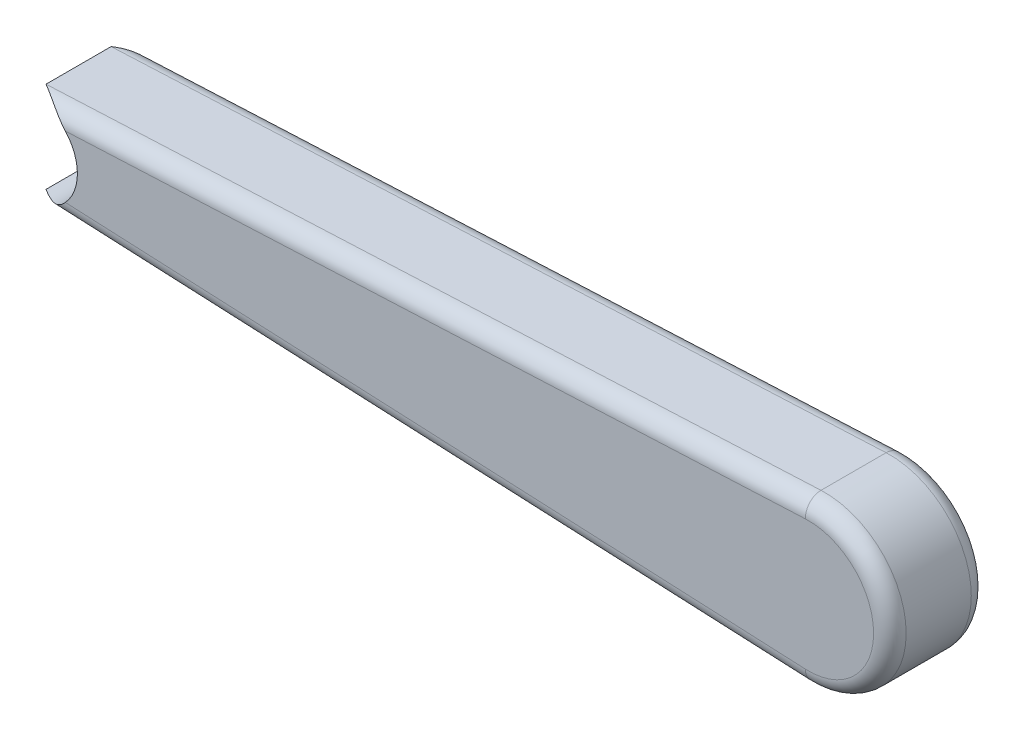
ISO-10303-21;
HEADER;
FILE_DESCRIPTION(('STEP AP214'),'2;1');
FILE_NAME('part.step','',(''),(''),'','','');
FILE_SCHEMA(('AUTOMOTIVE_DESIGN { 1 0 10303 214 1 1 1 1 }'));
ENDSEC;
DATA;
#1=APPLICATION_CONTEXT('core data for automotive mechanical design processes');
#2=APPLICATION_PROTOCOL_DEFINITION('international standard','automotive_design',2000,#1);
#3=PRODUCT_CONTEXT('',#1,'mechanical');
#4=PRODUCT('Part','Part','',(#3));
#5=PRODUCT_RELATED_PRODUCT_CATEGORY('part','',(#4));
#6=PRODUCT_DEFINITION_FORMATION('','',#4);
#7=PRODUCT_DEFINITION_CONTEXT('part definition',#1,'design');
#8=PRODUCT_DEFINITION('design','',#6,#7);
#9=PRODUCT_DEFINITION_SHAPE('','',#8);
#10=(LENGTH_UNIT() NAMED_UNIT(*) SI_UNIT(.MILLI.,.METRE.));
#11=(NAMED_UNIT(*) PLANE_ANGLE_UNIT() SI_UNIT($,.RADIAN.));
#12=(NAMED_UNIT(*) SI_UNIT($,.STERADIAN.) SOLID_ANGLE_UNIT());
#13=UNCERTAINTY_MEASURE_WITH_UNIT(LENGTH_MEASURE(1.E-05),#10,'distance_accuracy_value','');
#14=(GEOMETRIC_REPRESENTATION_CONTEXT(3) GLOBAL_UNCERTAINTY_ASSIGNED_CONTEXT((#13)) GLOBAL_UNIT_ASSIGNED_CONTEXT((#10,
#11,#12)) REPRESENTATION_CONTEXT('',''));
#15=CARTESIAN_POINT('',(0.,0.,0.));
#16=DIRECTION('',(0.,0.,1.));
#17=DIRECTION('',(1.,0.,0.));
#18=AXIS2_PLACEMENT_3D('',#15,#16,#17);
#19=CARTESIAN_POINT('',(-0.449126792822246,-9.72752272707756,15.));
#20=DIRECTION('',(-0.0461215932914046,-0.998935833090525,0.));
#21=DIRECTION('',(0.998935833090526,-0.0461215932914046,0.));
#22=AXIS2_PLACEMENT_3D('',#19,#20,#21);
#23=PLANE('',#22);
#24=DIRECTION('',(0.,0.,-1.));
#25=VECTOR('',#24,1.);
#26=CARTESIAN_POINT('',(59.3111452820953,-12.4866979136316,15.));
#27=LINE('',#26,#25);
#28=CARTESIAN_POINT('',(59.3111452820953,-12.4866979136316,12.5));
#29=VERTEX_POINT('',#28);
#30=CARTESIAN_POINT('',(59.3111452820953,-12.4866979136316,2.5));
#31=VERTEX_POINT('',#30);
#32=EDGE_CURVE('E109',#29,#31,#27,.T.);
#33=ORIENTED_EDGE('',*,*,#32,.F.);
#34=DIRECTION('',(-0.998935833090526,0.0461215932914046,0.));
#35=VECTOR('',#34,1.);
#36=CARTESIAN_POINT('',(-0.449126792822246,-9.72752272707756,12.5));
#37=LINE('',#36,#35);
#38=CARTESIAN_POINT('',(-59.6851859548019,-6.99255083163368,12.5));
#39=VERTEX_POINT('',#38);
#40=EDGE_CURVE('E123',#29,#39,#37,.T.);
#41=ORIENTED_EDGE('',*,*,#40,.T.);
#42=DIRECTION('',(0.,0.,-1.));
#43=VECTOR('',#42,1.);
#44=CARTESIAN_POINT('',(-59.6851859548019,-6.99255083163368,15.));
#45=LINE('',#44,#43);
#46=CARTESIAN_POINT('',(-59.6851859548019,-6.99255083163368,2.5));
#47=VERTEX_POINT('',#46);
#48=EDGE_CURVE('E230',#39,#47,#45,.T.);
#49=ORIENTED_EDGE('',*,*,#48,.T.);
#50=DIRECTION('',(-0.998935833090526,0.0461215932914046,0.));
#51=VECTOR('',#50,1.);
#52=CARTESIAN_POINT('',(59.3111452820954,-12.4866979136316,2.5));
#53=LINE('',#52,#51);
#54=EDGE_CURVE('E126',#47,#31,#53,.F.);
#55=ORIENTED_EDGE('',*,*,#54,.T.);
#56=EDGE_LOOP('',(#33,#41,#49,#55));
#57=FACE_BOUND('',#56,.T.);
#58=ADVANCED_FACE('F37',(#57),#23,.T.);
#59=CARTESIAN_POINT('',(59.8876651982379,0.,15.));
#60=DIRECTION('',(0.,0.,-1.));
#61=DIRECTION('',(-1.,0.,0.));
#62=AXIS2_PLACEMENT_3D('',#59,#60,#61);
#63=CYLINDRICAL_SURFACE('',#62,12.5);
#64=DIRECTION('',(0.,0.,-1.));
#65=VECTOR('',#64,1.);
#66=CARTESIAN_POINT('',(59.3111452820953,12.4866979136316,15.));
#67=LINE('',#66,#65);
#68=CARTESIAN_POINT('',(59.3111452820953,12.4866979136316,12.5));
#69=VERTEX_POINT('',#68);
#70=CARTESIAN_POINT('',(59.3111452820953,12.4866979136316,2.5));
#71=VERTEX_POINT('',#70);
#72=EDGE_CURVE('E112',#69,#71,#67,.T.);
#73=ORIENTED_EDGE('',*,*,#72,.F.);
#74=CARTESIAN_POINT('',(59.8876651982379,0.,12.5));
#75=DIRECTION('',(0.,0.,1.));
#76=DIRECTION('',(1.,0.,0.));
#77=AXIS2_PLACEMENT_3D('',#74,#75,#76);
#78=CIRCLE('',#77,12.5);
#79=EDGE_CURVE('E106',#69,#29,#78,.F.);
#80=ORIENTED_EDGE('',*,*,#79,.T.);
#81=ORIENTED_EDGE('',*,*,#32,.T.);
#82=CARTESIAN_POINT('',(59.8876651982379,0.,2.5));
#83=DIRECTION('',(0.,0.,1.));
#84=DIRECTION('',(1.,0.,0.));
#85=AXIS2_PLACEMENT_3D('',#82,#83,#84);
#86=CIRCLE('',#85,12.5);
#87=EDGE_CURVE('E117',#31,#71,#86,.T.);
#88=ORIENTED_EDGE('',*,*,#87,.T.);
#89=EDGE_LOOP('',(#73,#80,#81,#88));
#90=FACE_BOUND('',#89,.T.);
#91=ADVANCED_FACE('F108',(#90),#63,.T.);
#92=CARTESIAN_POINT('',(-0.449126792822246,9.72752272707756,15.));
#93=DIRECTION('',(-0.0461215932914046,0.998935833090525,0.));
#94=DIRECTION('',(-0.998935833090526,-0.0461215932914046,0.));
#95=AXIS2_PLACEMENT_3D('',#92,#93,#94);
#96=PLANE('',#95);
#97=DIRECTION('',(0.,0.,-1.));
#98=VECTOR('',#97,1.);
#99=CARTESIAN_POINT('',(-59.6851859548019,6.99255083163368,15.));
#100=LINE('',#99,#98);
#101=CARTESIAN_POINT('',(-59.6851859548019,6.99255083163368,12.5));
#102=VERTEX_POINT('',#101);
#103=CARTESIAN_POINT('',(-59.6851859548019,6.99255083163368,2.5));
#104=VERTEX_POINT('',#103);
#105=EDGE_CURVE('E224',#102,#104,#100,.T.);
#106=ORIENTED_EDGE('',*,*,#105,.F.);
#107=DIRECTION('',(0.998935833090526,0.0461215932914046,0.));
#108=VECTOR('',#107,1.);
#109=CARTESIAN_POINT('',(-0.449126792822246,9.72752272707756,12.5));
#110=LINE('',#109,#108);
#111=EDGE_CURVE('E11',#102,#69,#110,.T.);
#112=ORIENTED_EDGE('',*,*,#111,.T.);
#113=ORIENTED_EDGE('',*,*,#72,.T.);
#114=DIRECTION('',(0.998935833090526,0.0461215932914046,0.));
#115=VECTOR('',#114,1.);
#116=CARTESIAN_POINT('',(-59.685185954802,6.99255083163368,2.5));
#117=LINE('',#116,#115);
#118=EDGE_CURVE('E47',#71,#104,#117,.F.);
#119=ORIENTED_EDGE('',*,*,#118,.T.);
#120=EDGE_LOOP('',(#106,#112,#113,#119));
#121=FACE_BOUND('',#120,.T.);
#122=ADVANCED_FACE('F162',(#121),#96,.T.);
#123=CARTESIAN_POINT('',(-59.3623348017621,0.,15.));
#124=DIRECTION('',(0.,0.,-1.));
#125=DIRECTION('',(-1.,0.,0.));
#126=AXIS2_PLACEMENT_3D('',#123,#124,#125);
#127=CYLINDRICAL_SURFACE('',#126,7.);
#128=ORIENTED_EDGE('',*,*,#48,.F.);
#129=CARTESIAN_POINT('',(-54.2136852835608,-4.74251074207802,15.));
#130=CARTESIAN_POINT('',(-54.2857688809073,-4.82078786130837,14.999989903161));
#131=CARTESIAN_POINT('',(-54.3596120330912,-4.89735387343226,14.9960147027452));
#132=CARTESIAN_POINT('',(-54.5102333802524,-5.046611148359,14.9810015135034));
#133=CARTESIAN_POINT('',(-54.5870072357984,-5.1193077853945,14.9699736130719));
#134=CARTESIAN_POINT('',(-54.7424854727158,-5.26002993660031,14.9418313537456));
#135=CARTESIAN_POINT('',(-54.8211693137245,-5.32808836945269,14.9247667539175));
#136=CARTESIAN_POINT('',(-54.9807037027159,-5.46003941384874,14.88527111107));
#137=CARTESIAN_POINT('',(-55.0615553598209,-5.52392983322105,14.8628372725938));
#138=CARTESIAN_POINT('',(-55.2711874887031,-5.68226924250099,14.7992974874816));
#139=CARTESIAN_POINT('',(-55.4012833091692,-5.77363198037448,14.7547962663925));
#140=CARTESIAN_POINT('',(-55.6648463666458,-5.94587168628554,14.6565059740294));
#141=CARTESIAN_POINT('',(-55.7983147824306,-6.02674492577692,14.6027136159286));
#142=CARTESIAN_POINT('',(-56.0685814474761,-6.1786204972817,14.4872903982221));
#143=CARTESIAN_POINT('',(-56.2053944111578,-6.24956351387237,14.4256163234066));
#144=CARTESIAN_POINT('',(-56.4809558106255,-6.38129944335314,14.2961550084738));
#145=CARTESIAN_POINT('',(-56.6197042350546,-6.44209241577465,14.2283678042144));
#146=CARTESIAN_POINT('',(-56.9572689709623,-6.57732413571593,14.0583732052278));
#147=CARTESIAN_POINT('',(-57.1568380480167,-6.64676988067116,13.9536672026404));
#148=CARTESIAN_POINT('',(-57.5578572659798,-6.76666018853576,13.737138992786));
#149=CARTESIAN_POINT('',(-57.7593082618211,-6.81709563741483,13.6253134021573));
#150=CARTESIAN_POINT('',(-58.1627186261433,-6.89950722420976,13.3970650515206));
#151=CARTESIAN_POINT('',(-58.3646757455864,-6.9315257306403,13.2806535067423));
#152=CARTESIAN_POINT('',(-58.7687798554707,-6.97775311486921,13.0449079360379));
#153=CARTESIAN_POINT('',(-58.9709267234901,-6.99196981204316,12.9255752167271));
#154=CARTESIAN_POINT('',(-59.3390615821514,-7.00193348894461,12.7068771117413));
#155=CARTESIAN_POINT('',(-59.5051013470123,-7.00050999960199,12.6077257013232));
#156=CARTESIAN_POINT('',(-59.6756201465849,-6.99298757279725,12.5057226181347));
#157=CARTESIAN_POINT('',(-59.6804031797625,-6.99277165401399,12.5028612995492));
#158=CARTESIAN_POINT('',(-59.6851859548019,-6.99255083163368,12.5));
#159=B_SPLINE_CURVE_WITH_KNOTS('',3,(#129,#130,#131,#132,#133,#134,#135,#136,#137,#138,#139,
#140,#141,#142,#143,#144,#145,#146,#147,#148,#149,#150,#151,#152,#153,#154,#155,#156,#157,#158),
.UNSPECIFIED.,.F.,.F.,(4,2,2,2,2,2,2,2,2,2,2,2,2,2,4),(0.,0.319035638769247,0.637615936985806,
0.95362920020144,1.26980735281077,1.76429474066089,2.25895741769144,2.75645908447378,
3.25395783323755,3.96041067998187,4.66720178909223,5.37236034123229,6.07720904644113,
6.65699589126657,6.6737290982866),.UNSPECIFIED.);
#160=CARTESIAN_POINT('',(-54.2136852835608,-4.74251074207802,15.));
#161=VERTEX_POINT('',#160);
#162=EDGE_CURVE('E138',#39,#161,#159,.F.);
#163=ORIENTED_EDGE('',*,*,#162,.T.);
#164=CARTESIAN_POINT('',(-59.3623348017621,0.,15.));
#165=DIRECTION('',(0.,0.,1.));
#166=DIRECTION('',(1.,0.,0.));
#167=AXIS2_PLACEMENT_3D('',#164,#165,#166);
#168=CIRCLE('',#167,7.);
#169=CARTESIAN_POINT('',(-54.2136852835608,4.74251074207802,15.));
#170=VERTEX_POINT('',#169);
#171=EDGE_CURVE('E227',#161,#170,#168,.T.);
#172=ORIENTED_EDGE('',*,*,#171,.T.);
#173=CARTESIAN_POINT('',(-54.2136852835608,4.74251074207802,15.));
#174=CARTESIAN_POINT('',(-54.2857688809073,4.82078786130837,14.999989903161));
#175=CARTESIAN_POINT('',(-54.3596120330912,4.89735387343226,14.9960147027452));
#176=CARTESIAN_POINT('',(-54.5102333802524,5.046611148359,14.9810015135034));
#177=CARTESIAN_POINT('',(-54.5870072357984,5.1193077853945,14.9699736130719));
#178=CARTESIAN_POINT('',(-54.7424854727157,5.26002993660031,14.9418313537456));
#179=CARTESIAN_POINT('',(-54.8211693137245,5.32808836945269,14.9247667539175));
#180=CARTESIAN_POINT('',(-54.9807037027159,5.46003941384874,14.88527111107));
#181=CARTESIAN_POINT('',(-55.0615553598209,5.52392983322105,14.8628372725938));
#182=CARTESIAN_POINT('',(-55.2711874887032,5.682269242501,14.7992974874816));
#183=CARTESIAN_POINT('',(-55.4012833091692,5.77363198037449,14.7547962663925));
#184=CARTESIAN_POINT('',(-55.6648463666458,5.94587168628555,14.6565059740294));
#185=CARTESIAN_POINT('',(-55.7983147824306,6.02674492577693,14.6027136159286));
#186=CARTESIAN_POINT('',(-56.0685814474762,6.17862049728172,14.4872903982221));
#187=CARTESIAN_POINT('',(-56.2053944111578,6.24956351387238,14.4256163234066));
#188=CARTESIAN_POINT('',(-56.4809558106255,6.38129944335315,14.2961550084738));
#189=CARTESIAN_POINT('',(-56.6197042350546,6.44209241577466,14.2283678042144));
#190=CARTESIAN_POINT('',(-56.9572689709623,6.57732413571593,14.0583732052278));
#191=CARTESIAN_POINT('',(-57.1568380480168,6.64676988067116,13.9536672026405));
#192=CARTESIAN_POINT('',(-57.5578572659797,6.76666018853576,13.737138992786));
#193=CARTESIAN_POINT('',(-57.759308261821,6.81709563741484,13.6253134021572));
#194=CARTESIAN_POINT('',(-58.1627186261433,6.89950722420976,13.3970650515206));
#195=CARTESIAN_POINT('',(-58.3646757455865,6.93152573064029,13.2806535067424));
#196=CARTESIAN_POINT('',(-58.7687798554707,6.97775311486922,13.0449079360378));
#197=CARTESIAN_POINT('',(-58.9709267234899,6.99196981204318,12.9255752167267));
#198=CARTESIAN_POINT('',(-59.3390615821516,7.0019334889446,12.7068771117417));
#199=CARTESIAN_POINT('',(-59.5051013470129,7.00050999960194,12.6077257013243));
#200=CARTESIAN_POINT('',(-59.675620146585,6.99298757279725,12.5057226181347));
#201=CARTESIAN_POINT('',(-59.6804031797625,6.99277165401399,12.5028612995493));
#202=CARTESIAN_POINT('',(-59.6851859548019,6.99255083163369,12.5));
#203=B_SPLINE_CURVE_WITH_KNOTS('',3,(#173,#174,#175,#176,#177,#178,#179,#180,#181,#182,#183,
#184,#185,#186,#187,#188,#189,#190,#191,#192,#193,#194,#195,#196,#197,#198,#199,#200,#201,#202),
.UNSPECIFIED.,.F.,.F.,(4,2,2,2,2,2,2,2,2,2,2,2,2,2,4),(0.,0.319035638769244,0.637615936985786,
0.953629200201438,1.26980735281077,1.7642947406609,2.25895741769147,2.75645908447379,
3.25395783323755,3.96041067998187,4.66720178909221,5.37236034123227,6.07720904644113,
6.65699589126657,6.6737290982866),.UNSPECIFIED.);
#204=EDGE_CURVE('E141',#170,#102,#203,.T.);
#205=ORIENTED_EDGE('',*,*,#204,.T.);
#206=ORIENTED_EDGE('',*,*,#105,.T.);
#207=CARTESIAN_POINT('',(-54.2136852835608,4.74251074207801,0.));
#208=CARTESIAN_POINT('',(-54.2857688809073,4.82078786130838,1.00968389873677E-05));
#209=CARTESIAN_POINT('',(-54.3596120330912,4.89735387343227,0.00398529725479135));
#210=CARTESIAN_POINT('',(-54.5102333802524,5.04661114835903,0.0189984864965754));
#211=CARTESIAN_POINT('',(-54.5870072357984,5.11930778539454,0.0300263869280563));
#212=CARTESIAN_POINT('',(-54.7424854727158,5.26002993660035,0.0581686462543731));
#213=CARTESIAN_POINT('',(-54.8211693137245,5.32808836945272,0.0752332460824593));
#214=CARTESIAN_POINT('',(-54.9807037027159,5.46003941384875,0.114728888930019));
#215=CARTESIAN_POINT('',(-55.0615553598209,5.52392983322105,0.137162727406194));
#216=CARTESIAN_POINT('',(-55.2711874887031,5.68226924250099,0.200702512518371));
#217=CARTESIAN_POINT('',(-55.4012833091692,5.77363198037447,0.24520373360753));
#218=CARTESIAN_POINT('',(-55.6648463666458,5.94587168628552,0.343494025970577));
#219=CARTESIAN_POINT('',(-55.7983147824305,6.0267449257769,0.397286384071358));
#220=CARTESIAN_POINT('',(-56.0685814474761,6.17862049728169,0.512709601777909));
#221=CARTESIAN_POINT('',(-56.2053944111578,6.24956351387236,0.57438367659342));
#222=CARTESIAN_POINT('',(-56.4809558106255,6.38129944335314,0.703844991526236));
#223=CARTESIAN_POINT('',(-56.6197042350546,6.44209241577465,0.7716321957856));
#224=CARTESIAN_POINT('',(-56.9572689709623,6.57732413571593,0.941626794772241));
#225=CARTESIAN_POINT('',(-57.1568380480167,6.64676988067116,1.04633279735957));
#226=CARTESIAN_POINT('',(-57.5578572659798,6.76666018853577,1.26286100721403));
#227=CARTESIAN_POINT('',(-57.7593082618211,6.81709563741484,1.37468659784271));
#228=CARTESIAN_POINT('',(-58.1627186261433,6.89950722420977,1.6029349484795));
#229=CARTESIAN_POINT('',(-58.3646757455863,6.9315257306403,1.71934649325794));
#230=CARTESIAN_POINT('',(-58.7687798554709,6.9777531148692,1.95509206396187));
#231=CARTESIAN_POINT('',(-58.9709267234906,6.99196981204314,2.07442478327217));
#232=CARTESIAN_POINT('',(-59.339061582151,7.00193348894463,2.29312288825929));
#233=CARTESIAN_POINT('',(-59.5051013470109,7.00050999960205,2.39227429867898));
#234=CARTESIAN_POINT('',(-59.6756201465849,6.99298757279725,2.49427738186546));
#235=CARTESIAN_POINT('',(-59.6804031797625,6.99277165401399,2.49713870045082));
#236=CARTESIAN_POINT('',(-59.6851859548019,6.99255083163368,2.5));
#237=B_SPLINE_CURVE_WITH_KNOTS('',3,(#207,#208,#209,#210,#211,#212,#213,#214,#215,#216,#217,
#218,#219,#220,#221,#222,#223,#224,#225,#226,#227,#228,#229,#230,#231,#232,#233,#234,#235,#236),
.UNSPECIFIED.,.F.,.F.,(4,2,2,2,2,2,2,2,2,2,2,2,2,2,4),(0.,0.319035638769276,0.637615936985863,
0.953629200201476,1.26980735281077,1.76429474066086,2.25895741769139,2.75645908447376,
3.25395783323755,3.96041067998189,4.66720178909227,5.37236034123231,6.07720904644113,
6.65699589126657,6.6737290982866),.UNSPECIFIED.);
#238=CARTESIAN_POINT('',(-54.2136852835608,4.74251074207802,0.));
#239=VERTEX_POINT('',#238);
#240=EDGE_CURVE('E139',#104,#239,#237,.F.);
#241=ORIENTED_EDGE('',*,*,#240,.T.);
#242=CARTESIAN_POINT('',(-59.3623348017621,0.,0.));
#243=DIRECTION('',(0.,0.,1.));
#244=DIRECTION('',(1.,0.,0.));
#245=AXIS2_PLACEMENT_3D('',#242,#243,#244);
#246=CIRCLE('',#245,7.);
#247=CARTESIAN_POINT('',(-54.2136852835608,-4.74251074207802,0.));
#248=VERTEX_POINT('',#247);
#249=EDGE_CURVE('E235',#248,#239,#246,.T.);
#250=ORIENTED_EDGE('',*,*,#249,.F.);
#251=CARTESIAN_POINT('',(-54.2136852835608,-4.74251074207801,0.));
#252=CARTESIAN_POINT('',(-54.2857688809073,-4.82078786130839,1.0096838987301E-05));
#253=CARTESIAN_POINT('',(-54.3596120330912,-4.89735387343229,0.00398529725479232));
#254=CARTESIAN_POINT('',(-54.5102333802524,-5.04661114835906,0.01899848649658));
#255=CARTESIAN_POINT('',(-54.5870072357985,-5.11930778539458,0.0300263869280634));
#256=CARTESIAN_POINT('',(-54.7424854727158,-5.26002993660039,0.0581686462543831));
#257=CARTESIAN_POINT('',(-54.8211693137246,-5.32808836945275,0.0752332460824681));
#258=CARTESIAN_POINT('',(-54.9807037027159,-5.46003941384877,0.114728888930024));
#259=CARTESIAN_POINT('',(-55.0615553598209,-5.52392983322106,0.137162727406197));
#260=CARTESIAN_POINT('',(-55.2711874887031,-5.68226924250098,0.200702512518369));
#261=CARTESIAN_POINT('',(-55.4012833091692,-5.77363198037446,0.245203733607524));
#262=CARTESIAN_POINT('',(-55.6648463666457,-5.9458716862855,0.343494025970564));
#263=CARTESIAN_POINT('',(-55.7983147824305,-6.02674492577687,0.39728638407134));
#264=CARTESIAN_POINT('',(-56.0685814474761,-6.17862049728166,0.51270960177789));
#265=CARTESIAN_POINT('',(-56.2053944111578,-6.24956351387234,0.574383676593405));
#266=CARTESIAN_POINT('',(-56.4809558106255,-6.38129944335313,0.703844991526227));
#267=CARTESIAN_POINT('',(-56.6197042350546,-6.44209241577465,0.771632195785594));
#268=CARTESIAN_POINT('',(-56.9572689709623,-6.57732413571593,0.941626794772249));
#269=CARTESIAN_POINT('',(-57.1568380480167,-6.64676988067116,1.0463327973596));
#270=CARTESIAN_POINT('',(-57.5578572659798,-6.76666018853578,1.26286100721402));
#271=CARTESIAN_POINT('',(-57.7593082618212,-6.81709563741485,1.37468659784265));
#272=CARTESIAN_POINT('',(-58.1627186261433,-6.89950722420978,1.60293494847961));
#273=CARTESIAN_POINT('',(-58.3646757455862,-6.93152573064032,1.71934649325826));
#274=CARTESIAN_POINT('',(-58.7687798554711,-6.9777531148692,1.95509206396159));
#275=CARTESIAN_POINT('',(-58.9709267234913,-6.99196981204311,2.07442478327107));
#276=CARTESIAN_POINT('',(-59.3390615821504,-7.00193348894465,2.2931228882602));
#277=CARTESIAN_POINT('',(-59.5051013470091,-7.00050999960213,2.39227429868209));
#278=CARTESIAN_POINT('',(-59.6756201465848,-6.99298757279726,2.49427738186564));
#279=CARTESIAN_POINT('',(-59.6804031797624,-6.99277165401399,2.49713870045091));
#280=CARTESIAN_POINT('',(-59.6851859548019,-6.99255083163368,2.5));
#281=B_SPLINE_CURVE_WITH_KNOTS('',3,(#251,#252,#253,#254,#255,#256,#257,#258,#259,#260,#261,
#262,#263,#264,#265,#266,#267,#268,#269,#270,#271,#272,#273,#274,#275,#276,#277,#278,#279,#280),
.UNSPECIFIED.,.F.,.F.,(4,2,2,2,2,2,2,2,2,2,2,2,2,2,4),(0.,0.319035638769314,0.637615936985938,
0.953629200201512,1.26980735281077,1.76429474066082,2.25895741769132,2.75645908447373,
3.25395783323755,3.9604106799819,4.66720178909233,5.37236034123235,6.07720904644112,
6.65699589126657,6.6737290982866),.UNSPECIFIED.);
#282=EDGE_CURVE('E171',#248,#47,#281,.T.);
#283=ORIENTED_EDGE('',*,*,#282,.T.);
#284=EDGE_LOOP('',(#128,#163,#172,#205,#206,#241,#250,#283));
#285=FACE_BOUND('',#284,.T.);
#286=ADVANCED_FACE('F156',(#285),#127,.F.);
#287=CARTESIAN_POINT('',(0.,0.,15.));
#288=DIRECTION('',(0.,0.,1.));
#289=DIRECTION('',(1.,0.,0.));
#290=AXIS2_PLACEMENT_3D('',#287,#288,#289);
#291=PLANE('',#290);
#292=ORIENTED_EDGE('',*,*,#171,.F.);
#293=DIRECTION('',(-0.998935833090526,0.0461215932914046,0.));
#294=VECTOR('',#293,1.);
#295=CARTESIAN_POINT('',(-0.333822809593734,-7.23018314435125,15.));
#296=LINE('',#295,#294);
#297=CARTESIAN_POINT('',(59.4264492653238,-9.98935833090526,15.));
#298=VERTEX_POINT('',#297);
#299=EDGE_CURVE('E257',#161,#298,#296,.F.);
#300=ORIENTED_EDGE('',*,*,#299,.T.);
#301=CARTESIAN_POINT('',(59.8876651982379,0.,15.));
#302=DIRECTION('',(0.,0.,1.));
#303=DIRECTION('',(1.,0.,0.));
#304=AXIS2_PLACEMENT_3D('',#301,#302,#303);
#305=CIRCLE('',#304,10.);
#306=CARTESIAN_POINT('',(59.4264492653238,9.98935833090526,15.));
#307=VERTEX_POINT('',#306);
#308=EDGE_CURVE('E132',#298,#307,#305,.T.);
#309=ORIENTED_EDGE('',*,*,#308,.T.);
#310=DIRECTION('',(0.998935833090526,0.0461215932914046,0.));
#311=VECTOR('',#310,1.);
#312=CARTESIAN_POINT('',(-0.333822809593735,7.23018314435125,15.));
#313=LINE('',#312,#311);
#314=EDGE_CURVE('E220',#307,#170,#313,.F.);
#315=ORIENTED_EDGE('',*,*,#314,.T.);
#316=EDGE_LOOP('',(#292,#300,#309,#315));
#317=FACE_BOUND('',#316,.T.);
#318=ADVANCED_FACE('F161',(#317),#291,.T.);
#319=CARTESIAN_POINT('',(0.,0.,0.));
#320=DIRECTION('',(0.,0.,1.));
#321=DIRECTION('',(1.,0.,0.));
#322=AXIS2_PLACEMENT_3D('',#319,#320,#321);
#323=PLANE('',#322);
#324=CARTESIAN_POINT('',(59.8876651982379,0.,0.));
#325=DIRECTION('',(0.,0.,-1.));
#326=DIRECTION('',(-1.,0.,0.));
#327=AXIS2_PLACEMENT_3D('',#324,#325,#326);
#328=CIRCLE('',#327,5.);
#329=CARTESIAN_POINT('',(54.8876651982379,0.,0.));
#330=VERTEX_POINT('',#329);
#331=EDGE_CURVE('E239',#330,#330,#328,.T.);
#332=ORIENTED_EDGE('',*,*,#331,.F.);
#333=EDGE_LOOP('',(#332));
#334=FACE_BOUND('',#333,.T.);
#335=CARTESIAN_POINT('',(59.8876651982379,0.,0.));
#336=DIRECTION('',(0.,0.,1.));
#337=DIRECTION('',(1.,0.,0.));
#338=AXIS2_PLACEMENT_3D('',#335,#336,#337);
#339=CIRCLE('',#338,10.);
#340=CARTESIAN_POINT('',(59.4264492653238,9.98935833090525,0.));
#341=VERTEX_POINT('',#340);
#342=CARTESIAN_POINT('',(59.4264492653238,-9.98935833090526,0.));
#343=VERTEX_POINT('',#342);
#344=EDGE_CURVE('E55',#341,#343,#339,.F.);
#345=ORIENTED_EDGE('',*,*,#344,.T.);
#346=DIRECTION('',(-0.998935833090526,0.0461215932914046,0.));
#347=VECTOR('',#346,1.);
#348=CARTESIAN_POINT('',(-59.5698819715735,-4.49521124890736,0.));
#349=LINE('',#348,#347);
#350=EDGE_CURVE('E264',#343,#248,#349,.T.);
#351=ORIENTED_EDGE('',*,*,#350,.T.);
#352=ORIENTED_EDGE('',*,*,#249,.T.);
#353=DIRECTION('',(0.998935833090526,0.0461215932914046,0.));
#354=VECTOR('',#353,1.);
#355=CARTESIAN_POINT('',(59.4264492653239,9.98935833090525,0.));
#356=LINE('',#355,#354);
#357=EDGE_CURVE('E60',#239,#341,#356,.T.);
#358=ORIENTED_EDGE('',*,*,#357,.T.);
#359=EDGE_LOOP('',(#345,#351,#352,#358));
#360=FACE_BOUND('',#359,.T.);
#361=ADVANCED_FACE('F164',(#334,#360),#323,.F.);
#362=CARTESIAN_POINT('',(59.8876651982379,0.,10.));
#363=DIRECTION('',(0.,0.,-1.));
#364=DIRECTION('',(-1.,0.,0.));
#365=AXIS2_PLACEMENT_3D('',#362,#363,#364);
#366=CYLINDRICAL_SURFACE('',#365,5.);
#367=CARTESIAN_POINT('',(59.8876651982379,0.,10.));
#368=DIRECTION('',(0.,0.,-1.));
#369=DIRECTION('',(-1.,0.,0.));
#370=AXIS2_PLACEMENT_3D('',#367,#368,#369);
#371=CIRCLE('',#370,5.);
#372=CARTESIAN_POINT('',(54.8876651982379,0.,10.));
#373=VERTEX_POINT('',#372);
#374=EDGE_CURVE('E237',#373,#373,#371,.T.);
#375=ORIENTED_EDGE('',*,*,#374,.F.);
#376=EDGE_LOOP('',(#375));
#377=FACE_BOUND('',#376,.T.);
#378=ORIENTED_EDGE('',*,*,#331,.T.);
#379=EDGE_LOOP('',(#378));
#380=FACE_BOUND('',#379,.T.);
#381=ADVANCED_FACE('F214',(#377,#380),#366,.F.);
#382=CARTESIAN_POINT('',(59.8876651982379,0.,10.));
#383=DIRECTION('',(0.,0.,-1.));
#384=DIRECTION('',(-1.,0.,0.));
#385=AXIS2_PLACEMENT_3D('',#382,#383,#384);
#386=PLANE('',#385);
#387=ORIENTED_EDGE('',*,*,#374,.T.);
#388=EDGE_LOOP('',(#387));
#389=FACE_BOUND('',#388,.T.);
#390=ADVANCED_FACE('F209',(#389),#386,.T.);
#391=CARTESIAN_POINT('',(-0.333822809593735,7.23018314435125,12.5));
#392=DIRECTION('',(0.998935833090526,0.0461215932914046,0.));
#393=DIRECTION('',(-0.0461215932914046,0.998935833090525,0.));
#394=AXIS2_PLACEMENT_3D('',#391,#392,#393);
#395=CYLINDRICAL_SURFACE('',#394,2.5);
#396=ORIENTED_EDGE('',*,*,#204,.F.);
#397=ORIENTED_EDGE('',*,*,#314,.F.);
#398=CARTESIAN_POINT('',(59.4264492653238,9.98935833090525,12.5));
#399=DIRECTION('',(0.998935833090526,0.0461215932914039,0.));
#400=DIRECTION('',(-0.0461215932914039,0.998935833090526,0.));
#401=AXIS2_PLACEMENT_3D('',#398,#399,#400);
#402=CIRCLE('',#401,2.5);
#403=EDGE_CURVE('E135',#69,#307,#402,.T.);
#404=ORIENTED_EDGE('',*,*,#403,.F.);
#405=ORIENTED_EDGE('',*,*,#111,.F.);
#406=EDGE_LOOP('',(#396,#397,#404,#405));
#407=FACE_BOUND('',#406,.T.);
#408=ADVANCED_FACE('F188',(#407),#395,.T.);
#409=CARTESIAN_POINT('',(59.8876651982379,0.,12.5));
#410=DIRECTION('',(0.,0.,1.));
#411=DIRECTION('',(1.,0.,0.));
#412=AXIS2_PLACEMENT_3D('',#409,#410,#411);
#413=TOROIDAL_SURFACE('',#412,10.,2.5);
#414=ORIENTED_EDGE('',*,*,#403,.T.);
#415=ORIENTED_EDGE('',*,*,#308,.F.);
#416=CARTESIAN_POINT('',(59.4264492653238,-9.98935833090526,12.5));
#417=DIRECTION('',(-0.998935833090526,0.0461215932914039,0.));
#418=DIRECTION('',(-0.0461215932914039,-0.998935833090526,0.));
#419=AXIS2_PLACEMENT_3D('',#416,#417,#418);
#420=CIRCLE('',#419,2.5);
#421=EDGE_CURVE('E130',#29,#298,#420,.T.);
#422=ORIENTED_EDGE('',*,*,#421,.F.);
#423=ORIENTED_EDGE('',*,*,#79,.F.);
#424=EDGE_LOOP('',(#414,#415,#422,#423));
#425=FACE_BOUND('',#424,.T.);
#426=ADVANCED_FACE('F131',(#425),#413,.T.);
#427=CARTESIAN_POINT('',(-0.333822809593734,-7.23018314435125,12.5));
#428=DIRECTION('',(-0.998935833090526,0.0461215932914046,0.));
#429=DIRECTION('',(-0.0461215932914046,-0.998935833090525,0.));
#430=AXIS2_PLACEMENT_3D('',#427,#428,#429);
#431=CYLINDRICAL_SURFACE('',#430,2.5);
#432=ORIENTED_EDGE('',*,*,#421,.T.);
#433=ORIENTED_EDGE('',*,*,#299,.F.);
#434=ORIENTED_EDGE('',*,*,#162,.F.);
#435=ORIENTED_EDGE('',*,*,#40,.F.);
#436=EDGE_LOOP('',(#432,#433,#434,#435));
#437=FACE_BOUND('',#436,.T.);
#438=ADVANCED_FACE('F137',(#437),#431,.T.);
#439=CARTESIAN_POINT('',(-0.333822809593735,7.23018314435125,2.5));
#440=DIRECTION('',(-0.998935833090526,-0.0461215932914046,0.));
#441=DIRECTION('',(0.0461215932914046,-0.998935833090525,0.));
#442=AXIS2_PLACEMENT_3D('',#439,#440,#441);
#443=CYLINDRICAL_SURFACE('',#442,2.5);
#444=ORIENTED_EDGE('',*,*,#240,.F.);
#445=ORIENTED_EDGE('',*,*,#118,.F.);
#446=CARTESIAN_POINT('',(59.4264492653238,9.98935833090525,2.5));
#447=DIRECTION('',(0.998935833090526,0.0461215932914038,0.));
#448=DIRECTION('',(-0.0461215932914038,0.998935833090526,0.));
#449=AXIS2_PLACEMENT_3D('',#446,#447,#448);
#450=CIRCLE('',#449,2.5);
#451=EDGE_CURVE('E42',#341,#71,#450,.T.);
#452=ORIENTED_EDGE('',*,*,#451,.F.);
#453=ORIENTED_EDGE('',*,*,#357,.F.);
#454=EDGE_LOOP('',(#444,#445,#452,#453));
#455=FACE_BOUND('',#454,.T.);
#456=ADVANCED_FACE('F39',(#455),#443,.T.);
#457=CARTESIAN_POINT('',(59.8876651982379,0.,2.5));
#458=DIRECTION('',(0.,0.,1.));
#459=DIRECTION('',(1.,0.,0.));
#460=AXIS2_PLACEMENT_3D('',#457,#458,#459);
#461=TOROIDAL_SURFACE('',#460,10.,2.5);
#462=ORIENTED_EDGE('',*,*,#451,.T.);
#463=ORIENTED_EDGE('',*,*,#87,.F.);
#464=CARTESIAN_POINT('',(59.4264492653238,-9.98935833090526,2.5));
#465=DIRECTION('',(-0.998935833090526,0.0461215932914039,0.));
#466=DIRECTION('',(-0.0461215932914039,-0.998935833090526,0.));
#467=AXIS2_PLACEMENT_3D('',#464,#465,#466);
#468=CIRCLE('',#467,2.5);
#469=EDGE_CURVE('E267',#343,#31,#468,.T.);
#470=ORIENTED_EDGE('',*,*,#469,.F.);
#471=ORIENTED_EDGE('',*,*,#344,.F.);
#472=EDGE_LOOP('',(#462,#463,#470,#471));
#473=FACE_BOUND('',#472,.T.);
#474=ADVANCED_FACE('F186',(#473),#461,.T.);
#475=CARTESIAN_POINT('',(-0.333822809593734,-7.23018314435125,2.5));
#476=DIRECTION('',(0.998935833090526,-0.0461215932914046,0.));
#477=DIRECTION('',(0.0461215932914046,0.998935833090525,0.));
#478=AXIS2_PLACEMENT_3D('',#475,#476,#477);
#479=CYLINDRICAL_SURFACE('',#478,2.5);
#480=ORIENTED_EDGE('',*,*,#469,.T.);
#481=ORIENTED_EDGE('',*,*,#54,.F.);
#482=ORIENTED_EDGE('',*,*,#282,.F.);
#483=ORIENTED_EDGE('',*,*,#350,.F.);
#484=EDGE_LOOP('',(#480,#481,#482,#483));
#485=FACE_BOUND('',#484,.T.);
#486=ADVANCED_FACE('F183',(#485),#479,.T.);
#487=CLOSED_SHELL('',(#58,#91,#122,#286,#318,#361,#381,#390,#408,#426,#438,#456,#474,#486));
#488=MANIFOLD_SOLID_BREP('B2',#487);
#489=ADVANCED_BREP_SHAPE_REPRESENTATION('',(#18,#488),#14);
#490=SHAPE_DEFINITION_REPRESENTATION(#9,#489);
ENDSEC;
END-ISO-10303-21;
